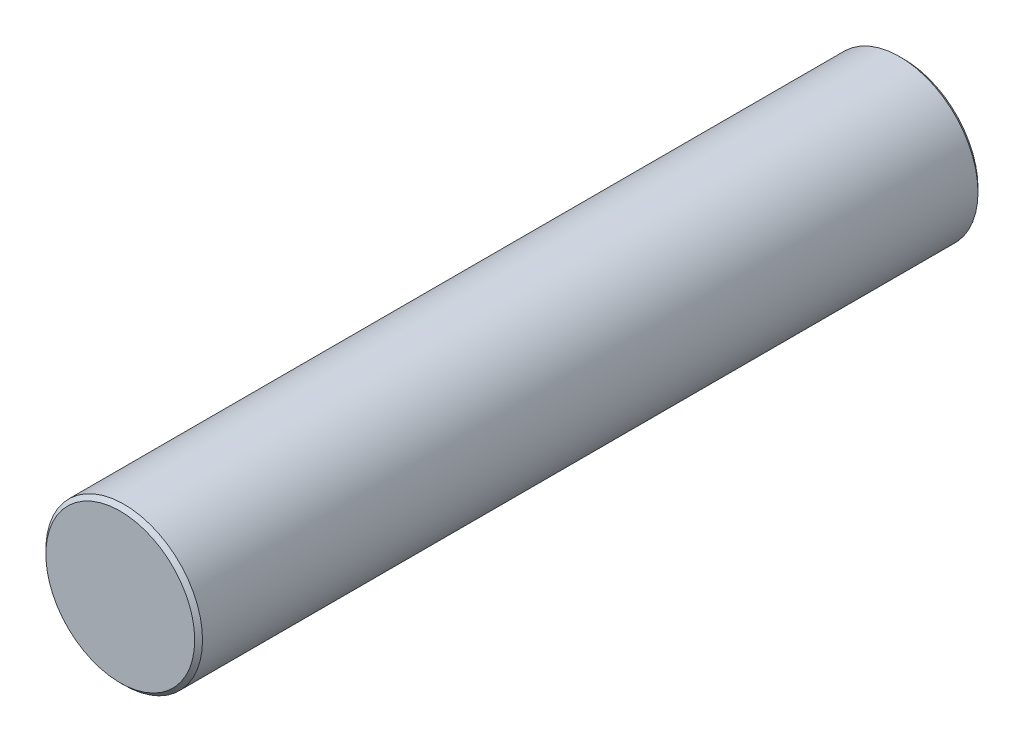
ISO-10303-21;
HEADER;
FILE_DESCRIPTION(('STEP AP214'),'2;1');
FILE_NAME('part.step','',(''),(''),'','','');
FILE_SCHEMA(('AUTOMOTIVE_DESIGN { 1 0 10303 214 1 1 1 1 }'));
ENDSEC;
DATA;
#1=APPLICATION_CONTEXT('core data for automotive mechanical design processes');
#2=APPLICATION_PROTOCOL_DEFINITION('international standard','automotive_design',2000,#1);
#3=PRODUCT_CONTEXT('',#1,'mechanical');
#4=PRODUCT('Part','Part','',(#3));
#5=PRODUCT_RELATED_PRODUCT_CATEGORY('part','',(#4));
#6=PRODUCT_DEFINITION_FORMATION('','',#4);
#7=PRODUCT_DEFINITION_CONTEXT('part definition',#1,'design');
#8=PRODUCT_DEFINITION('design','',#6,#7);
#9=PRODUCT_DEFINITION_SHAPE('','',#8);
#10=(LENGTH_UNIT() NAMED_UNIT(*) SI_UNIT(.MILLI.,.METRE.));
#11=(NAMED_UNIT(*) PLANE_ANGLE_UNIT() SI_UNIT($,.RADIAN.));
#12=(NAMED_UNIT(*) SI_UNIT($,.STERADIAN.) SOLID_ANGLE_UNIT());
#13=UNCERTAINTY_MEASURE_WITH_UNIT(LENGTH_MEASURE(1.E-05),#10,'distance_accuracy_value','');
#14=(GEOMETRIC_REPRESENTATION_CONTEXT(3) GLOBAL_UNCERTAINTY_ASSIGNED_CONTEXT((#13)) GLOBAL_UNIT_ASSIGNED_CONTEXT((#10,
#11,#12)) REPRESENTATION_CONTEXT('',''));
#15=CARTESIAN_POINT('',(0.,0.,0.));
#16=DIRECTION('',(0.,0.,1.));
#17=DIRECTION('',(1.,0.,0.));
#18=AXIS2_PLACEMENT_3D('',#15,#16,#17);
#19=CARTESIAN_POINT('',(0.,0.,20.));
#20=DIRECTION('',(0.,0.,-1.));
#21=DIRECTION('',(-1.,0.,0.));
#22=AXIS2_PLACEMENT_3D('',#19,#20,#21);
#23=CYLINDRICAL_SURFACE('',#22,2.);
#24=CARTESIAN_POINT('',(0.,0.,19.9));
#25=DIRECTION('',(0.,0.,1.));
#26=DIRECTION('',(1.,0.,0.));
#27=AXIS2_PLACEMENT_3D('',#24,#25,#26);
#28=CIRCLE('',#27,2.);
#29=CARTESIAN_POINT('',(2.,0.,19.9));
#30=VERTEX_POINT('',#29);
#31=EDGE_CURVE('E41',#30,#30,#28,.F.);
#32=ORIENTED_EDGE('',*,*,#31,.T.);
#33=EDGE_LOOP('',(#32));
#34=FACE_BOUND('',#33,.T.);
#35=CARTESIAN_POINT('',(0.,0.,0.0999999999999994));
#36=DIRECTION('',(0.,0.,1.));
#37=DIRECTION('',(1.,0.,0.));
#38=AXIS2_PLACEMENT_3D('',#35,#36,#37);
#39=CIRCLE('',#38,2.);
#40=CARTESIAN_POINT('',(2.,0.,0.0999999999999994));
#41=VERTEX_POINT('',#40);
#42=EDGE_CURVE('E45',#41,#41,#39,.T.);
#43=ORIENTED_EDGE('',*,*,#42,.T.);
#44=EDGE_LOOP('',(#43));
#45=FACE_BOUND('',#44,.T.);
#46=ADVANCED_FACE('F33',(#34,#45),#23,.T.);
#47=CARTESIAN_POINT('',(0.,0.,20.));
#48=DIRECTION('',(0.,0.,1.));
#49=DIRECTION('',(1.,0.,0.));
#50=AXIS2_PLACEMENT_3D('',#47,#48,#49);
#51=PLANE('',#50);
#52=CARTESIAN_POINT('',(0.,0.,20.));
#53=DIRECTION('',(0.,0.,1.));
#54=DIRECTION('',(1.,0.,0.));
#55=AXIS2_PLACEMENT_3D('',#52,#53,#54);
#56=CIRCLE('',#55,1.9);
#57=CARTESIAN_POINT('',(1.9,0.,20.));
#58=VERTEX_POINT('',#57);
#59=EDGE_CURVE('E49',#58,#58,#56,.T.);
#60=ORIENTED_EDGE('',*,*,#59,.T.);
#61=EDGE_LOOP('',(#60));
#62=FACE_BOUND('',#61,.T.);
#63=ADVANCED_FACE('F71',(#62),#51,.T.);
#64=CARTESIAN_POINT('',(0.,0.,0.));
#65=DIRECTION('',(0.,0.,1.));
#66=DIRECTION('',(1.,0.,0.));
#67=AXIS2_PLACEMENT_3D('',#64,#65,#66);
#68=PLANE('',#67);
#69=CARTESIAN_POINT('',(0.,0.,0.));
#70=DIRECTION('',(0.,0.,1.));
#71=DIRECTION('',(1.,0.,0.));
#72=AXIS2_PLACEMENT_3D('',#69,#70,#71);
#73=CIRCLE('',#72,1.9);
#74=CARTESIAN_POINT('',(1.9,0.,0.));
#75=VERTEX_POINT('',#74);
#76=EDGE_CURVE('E10',#75,#75,#73,.F.);
#77=ORIENTED_EDGE('',*,*,#76,.T.);
#78=EDGE_LOOP('',(#77));
#79=FACE_BOUND('',#78,.T.);
#80=CARTESIAN_POINT('',(0.,0.,0.));
#81=DIRECTION('',(0.,0.,-1.));
#82=DIRECTION('',(-1.,0.,0.));
#83=AXIS2_PLACEMENT_3D('',#80,#81,#82);
#84=CIRCLE('',#83,1.);
#85=CARTESIAN_POINT('',(-1.,0.,0.));
#86=VERTEX_POINT('',#85);
#87=EDGE_CURVE('E55',#86,#86,#84,.T.);
#88=ORIENTED_EDGE('',*,*,#87,.F.);
#89=EDGE_LOOP('',(#88));
#90=FACE_BOUND('',#89,.T.);
#91=ADVANCED_FACE('F66',(#79,#90),#68,.F.);
#92=CARTESIAN_POINT('',(0.,0.,11.));
#93=DIRECTION('',(0.,0.,-1.));
#94=DIRECTION('',(-1.,0.,0.));
#95=AXIS2_PLACEMENT_3D('',#92,#93,#94);
#96=CYLINDRICAL_SURFACE('',#95,1.);
#97=CARTESIAN_POINT('',(0.,0.,11.));
#98=DIRECTION('',(0.,0.,-1.));
#99=DIRECTION('',(-1.,0.,0.));
#100=AXIS2_PLACEMENT_3D('',#97,#98,#99);
#101=CIRCLE('',#100,1.);
#102=CARTESIAN_POINT('',(-1.,0.,11.));
#103=VERTEX_POINT('',#102);
#104=EDGE_CURVE('E54',#103,#103,#101,.T.);
#105=ORIENTED_EDGE('',*,*,#104,.F.);
#106=EDGE_LOOP('',(#105));
#107=FACE_BOUND('',#106,.T.);
#108=ORIENTED_EDGE('',*,*,#87,.T.);
#109=EDGE_LOOP('',(#108));
#110=FACE_BOUND('',#109,.T.);
#111=ADVANCED_FACE('F63',(#107,#110),#96,.F.);
#112=CARTESIAN_POINT('',(0.,0.,11.));
#113=DIRECTION('',(0.,0.,-1.));
#114=DIRECTION('',(-1.,0.,0.));
#115=AXIS2_PLACEMENT_3D('',#112,#113,#114);
#116=PLANE('',#115);
#117=ORIENTED_EDGE('',*,*,#104,.T.);
#118=EDGE_LOOP('',(#117));
#119=FACE_BOUND('',#118,.T.);
#120=ADVANCED_FACE('F61',(#119),#116,.T.);
#121=CARTESIAN_POINT('',(0.,0.,20.));
#122=DIRECTION('',(0.,0.,-1.));
#123=DIRECTION('',(-1.,0.,0.));
#124=AXIS2_PLACEMENT_3D('',#121,#122,#123);
#125=CONICAL_SURFACE('',#124,1.9,0.785398163397448);
#126=ORIENTED_EDGE('',*,*,#31,.F.);
#127=EDGE_LOOP('',(#126));
#128=FACE_BOUND('',#127,.T.);
#129=ORIENTED_EDGE('',*,*,#59,.F.);
#130=EDGE_LOOP('',(#129));
#131=FACE_BOUND('',#130,.T.);
#132=ADVANCED_FACE('F84',(#128,#131),#125,.T.);
#133=CARTESIAN_POINT('',(0.,0.,0.0999999999999994));
#134=DIRECTION('',(0.,0.,1.));
#135=DIRECTION('',(1.,0.,0.));
#136=AXIS2_PLACEMENT_3D('',#133,#134,#135);
#137=CONICAL_SURFACE('',#136,2.,0.785398163397457);
#138=ORIENTED_EDGE('',*,*,#76,.F.);
#139=EDGE_LOOP('',(#138));
#140=FACE_BOUND('',#139,.T.);
#141=ORIENTED_EDGE('',*,*,#42,.F.);
#142=EDGE_LOOP('',(#141));
#143=FACE_BOUND('',#142,.T.);
#144=ADVANCED_FACE('F36',(#140,#143),#137,.T.);
#145=CLOSED_SHELL('',(#46,#63,#91,#111,#120,#132,#144));
#146=MANIFOLD_SOLID_BREP('B2',#145);
#147=ADVANCED_BREP_SHAPE_REPRESENTATION('',(#18,#146),#14);
#148=SHAPE_DEFINITION_REPRESENTATION(#9,#147);
ENDSEC;
END-ISO-10303-21;
